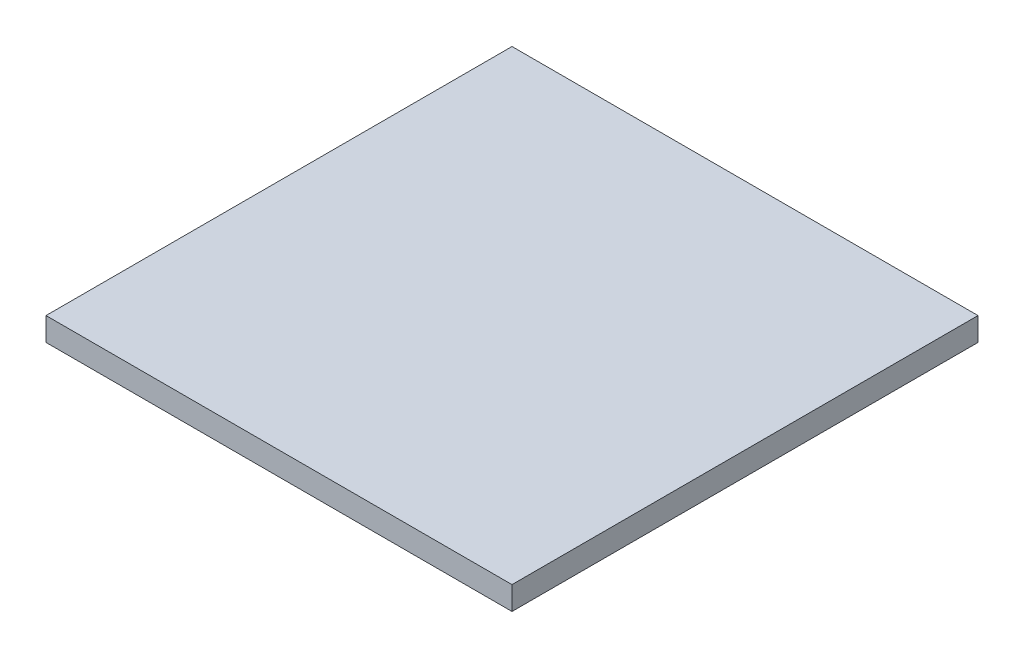
ISO-10303-21;
HEADER;
FILE_DESCRIPTION(('STEP AP214'),'2;1');
FILE_NAME('part.step','',(''),(''),'','','');
FILE_SCHEMA(('AUTOMOTIVE_DESIGN { 1 0 10303 214 1 1 1 1 }'));
ENDSEC;
DATA;
#1=APPLICATION_CONTEXT('core data for automotive mechanical design processes');
#2=APPLICATION_PROTOCOL_DEFINITION('international standard','automotive_design',2000,#1);
#3=PRODUCT_CONTEXT('',#1,'mechanical');
#4=PRODUCT('Part','Part','',(#3));
#5=PRODUCT_RELATED_PRODUCT_CATEGORY('part','',(#4));
#6=PRODUCT_DEFINITION_FORMATION('','',#4);
#7=PRODUCT_DEFINITION_CONTEXT('part definition',#1,'design');
#8=PRODUCT_DEFINITION('design','',#6,#7);
#9=PRODUCT_DEFINITION_SHAPE('','',#8);
#10=(LENGTH_UNIT() NAMED_UNIT(*) SI_UNIT(.MILLI.,.METRE.));
#11=(NAMED_UNIT(*) PLANE_ANGLE_UNIT() SI_UNIT($,.RADIAN.));
#12=(NAMED_UNIT(*) SI_UNIT($,.STERADIAN.) SOLID_ANGLE_UNIT());
#13=UNCERTAINTY_MEASURE_WITH_UNIT(LENGTH_MEASURE(1.E-05),#10,'distance_accuracy_value','');
#14=(GEOMETRIC_REPRESENTATION_CONTEXT(3) GLOBAL_UNCERTAINTY_ASSIGNED_CONTEXT((#13)) GLOBAL_UNIT_ASSIGNED_CONTEXT((#10,
#11,#12)) REPRESENTATION_CONTEXT('',''));
#15=CARTESIAN_POINT('',(0.,0.,0.));
#16=DIRECTION('',(0.,0.,1.));
#17=DIRECTION('',(1.,0.,0.));
#18=AXIS2_PLACEMENT_3D('',#15,#16,#17);
#19=CARTESIAN_POINT('',(0.,0.5,0.));
#20=DIRECTION('',(1.,0.,0.));
#21=DIRECTION('',(0.,0.,-1.));
#22=AXIS2_PLACEMENT_3D('',#19,#20,#21);
#23=PLANE('',#22);
#24=DIRECTION('',(0.,0.,1.));
#25=VECTOR('',#24,1.);
#26=CARTESIAN_POINT('',(0.,0.,0.));
#27=LINE('',#26,#25);
#28=CARTESIAN_POINT('',(0.,0.,-10.));
#29=VERTEX_POINT('',#28);
#30=CARTESIAN_POINT('',(0.,0.,0.));
#31=VERTEX_POINT('',#30);
#32=EDGE_CURVE('E96',#29,#31,#27,.T.);
#33=ORIENTED_EDGE('',*,*,#32,.T.);
#34=DIRECTION('',(0.,-1.,0.));
#35=VECTOR('',#34,1.);
#36=CARTESIAN_POINT('',(0.,0.5,0.));
#37=LINE('',#36,#35);
#38=CARTESIAN_POINT('',(0.,0.5,0.));
#39=VERTEX_POINT('',#38);
#40=EDGE_CURVE('E11',#39,#31,#37,.T.);
#41=ORIENTED_EDGE('',*,*,#40,.F.);
#42=DIRECTION('',(0.,0.,1.));
#43=VECTOR('',#42,1.);
#44=CARTESIAN_POINT('',(0.,0.5,0.));
#45=LINE('',#44,#43);
#46=CARTESIAN_POINT('',(0.,0.5,-10.));
#47=VERTEX_POINT('',#46);
#48=EDGE_CURVE('E84',#47,#39,#45,.T.);
#49=ORIENTED_EDGE('',*,*,#48,.F.);
#50=DIRECTION('',(0.,-1.,0.));
#51=VECTOR('',#50,1.);
#52=CARTESIAN_POINT('',(0.,0.5,-10.));
#53=LINE('',#52,#51);
#54=EDGE_CURVE('E92',#47,#29,#53,.T.);
#55=ORIENTED_EDGE('',*,*,#54,.T.);
#56=EDGE_LOOP('',(#33,#41,#49,#55));
#57=FACE_BOUND('',#56,.T.);
#58=ADVANCED_FACE('F33',(#57),#23,.F.);
#59=CARTESIAN_POINT('',(0.,0.5,0.));
#60=DIRECTION('',(0.,0.,-1.));
#61=DIRECTION('',(-1.,0.,0.));
#62=AXIS2_PLACEMENT_3D('',#59,#60,#61);
#63=PLANE('',#62);
#64=DIRECTION('',(1.,0.,0.));
#65=VECTOR('',#64,1.);
#66=CARTESIAN_POINT('',(0.,0.,0.));
#67=LINE('',#66,#65);
#68=CARTESIAN_POINT('',(10.,0.,0.));
#69=VERTEX_POINT('',#68);
#70=EDGE_CURVE('E88',#31,#69,#67,.T.);
#71=ORIENTED_EDGE('',*,*,#70,.T.);
#72=DIRECTION('',(0.,-1.,0.));
#73=VECTOR('',#72,1.);
#74=CARTESIAN_POINT('',(10.,0.5,0.));
#75=LINE('',#74,#73);
#76=CARTESIAN_POINT('',(10.,0.5,0.));
#77=VERTEX_POINT('',#76);
#78=EDGE_CURVE('E41',#77,#69,#75,.T.);
#79=ORIENTED_EDGE('',*,*,#78,.F.);
#80=DIRECTION('',(1.,0.,0.));
#81=VECTOR('',#80,1.);
#82=CARTESIAN_POINT('',(0.,0.5,0.));
#83=LINE('',#82,#81);
#84=EDGE_CURVE('E79',#39,#77,#83,.T.);
#85=ORIENTED_EDGE('',*,*,#84,.F.);
#86=ORIENTED_EDGE('',*,*,#40,.T.);
#87=EDGE_LOOP('',(#71,#79,#85,#86));
#88=FACE_BOUND('',#87,.T.);
#89=ADVANCED_FACE('F87',(#88),#63,.F.);
#90=CARTESIAN_POINT('',(10.,0.5,0.));
#91=DIRECTION('',(-1.,0.,0.));
#92=DIRECTION('',(0.,0.,1.));
#93=AXIS2_PLACEMENT_3D('',#90,#91,#92);
#94=PLANE('',#93);
#95=DIRECTION('',(0.,0.,-1.));
#96=VECTOR('',#95,1.);
#97=CARTESIAN_POINT('',(10.,0.,0.));
#98=LINE('',#97,#96);
#99=CARTESIAN_POINT('',(10.,0.,-10.));
#100=VERTEX_POINT('',#99);
#101=EDGE_CURVE('E66',#69,#100,#98,.T.);
#102=ORIENTED_EDGE('',*,*,#101,.T.);
#103=DIRECTION('',(0.,-1.,0.));
#104=VECTOR('',#103,1.);
#105=CARTESIAN_POINT('',(10.,0.5,-10.));
#106=LINE('',#105,#104);
#107=CARTESIAN_POINT('',(10.,0.5,-10.));
#108=VERTEX_POINT('',#107);
#109=EDGE_CURVE('E89',#108,#100,#106,.T.);
#110=ORIENTED_EDGE('',*,*,#109,.F.);
#111=DIRECTION('',(0.,0.,-1.));
#112=VECTOR('',#111,1.);
#113=CARTESIAN_POINT('',(10.,0.5,0.));
#114=LINE('',#113,#112);
#115=EDGE_CURVE('E82',#77,#108,#114,.T.);
#116=ORIENTED_EDGE('',*,*,#115,.F.);
#117=ORIENTED_EDGE('',*,*,#78,.T.);
#118=EDGE_LOOP('',(#102,#110,#116,#117));
#119=FACE_BOUND('',#118,.T.);
#120=ADVANCED_FACE('F90',(#119),#94,.F.);
#121=CARTESIAN_POINT('',(0.,0.5,-10.));
#122=DIRECTION('',(0.,0.,1.));
#123=DIRECTION('',(1.,0.,0.));
#124=AXIS2_PLACEMENT_3D('',#121,#122,#123);
#125=PLANE('',#124);
#126=DIRECTION('',(-1.,0.,0.));
#127=VECTOR('',#126,1.);
#128=CARTESIAN_POINT('',(0.,0.,-10.));
#129=LINE('',#128,#127);
#130=EDGE_CURVE('E72',#100,#29,#129,.T.);
#131=ORIENTED_EDGE('',*,*,#130,.T.);
#132=ORIENTED_EDGE('',*,*,#54,.F.);
#133=DIRECTION('',(-1.,0.,0.));
#134=VECTOR('',#133,1.);
#135=CARTESIAN_POINT('',(0.,0.5,-10.));
#136=LINE('',#135,#134);
#137=EDGE_CURVE('E49',#108,#47,#136,.T.);
#138=ORIENTED_EDGE('',*,*,#137,.F.);
#139=ORIENTED_EDGE('',*,*,#109,.T.);
#140=EDGE_LOOP('',(#131,#132,#138,#139));
#141=FACE_BOUND('',#140,.T.);
#142=ADVANCED_FACE('F103',(#141),#125,.F.);
#143=CARTESIAN_POINT('',(0.,0.5,0.));
#144=DIRECTION('',(0.,-1.,0.));
#145=DIRECTION('',(0.,0.,-1.));
#146=AXIS2_PLACEMENT_3D('',#143,#144,#145);
#147=PLANE('',#146);
#148=ORIENTED_EDGE('',*,*,#48,.T.);
#149=ORIENTED_EDGE('',*,*,#84,.T.);
#150=ORIENTED_EDGE('',*,*,#115,.T.);
#151=ORIENTED_EDGE('',*,*,#137,.T.);
#152=EDGE_LOOP('',(#148,#149,#150,#151));
#153=FACE_BOUND('',#152,.T.);
#154=ADVANCED_FACE('F80',(#153),#147,.F.);
#155=CARTESIAN_POINT('',(0.,0.,0.));
#156=DIRECTION('',(0.,-1.,0.));
#157=DIRECTION('',(0.,0.,-1.));
#158=AXIS2_PLACEMENT_3D('',#155,#156,#157);
#159=PLANE('',#158);
#160=ORIENTED_EDGE('',*,*,#32,.F.);
#161=ORIENTED_EDGE('',*,*,#130,.F.);
#162=ORIENTED_EDGE('',*,*,#101,.F.);
#163=ORIENTED_EDGE('',*,*,#70,.F.);
#164=EDGE_LOOP('',(#160,#161,#162,#163));
#165=FACE_BOUND('',#164,.T.);
#166=ADVANCED_FACE('F106',(#165),#159,.T.);
#167=CLOSED_SHELL('',(#58,#89,#120,#142,#154,#166));
#168=MANIFOLD_SOLID_BREP('B2',#167);
#169=ADVANCED_BREP_SHAPE_REPRESENTATION('',(#18,#168),#14);
#170=SHAPE_DEFINITION_REPRESENTATION(#9,#169);
ENDSEC;
END-ISO-10303-21;
